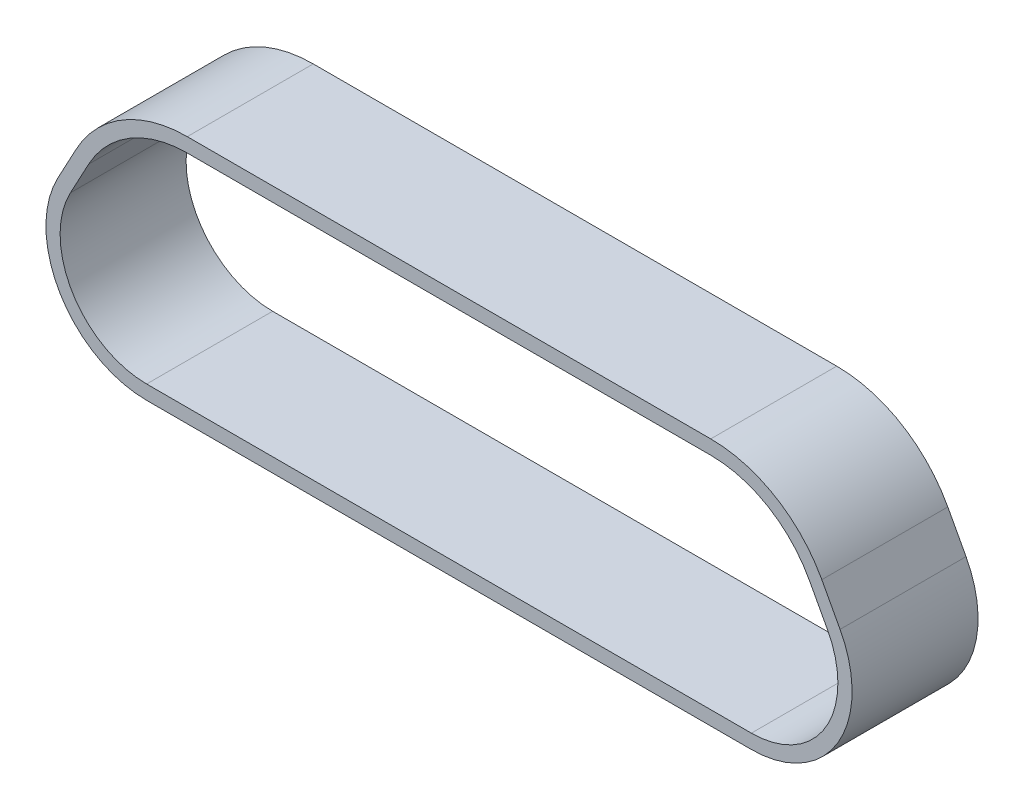
ISO-10303-21;
HEADER;
FILE_DESCRIPTION(('STEP AP214'),'2;1');
FILE_NAME('part.step','',(''),(''),'','','');
FILE_SCHEMA(('AUTOMOTIVE_DESIGN { 1 0 10303 214 1 1 1 1 }'));
ENDSEC;
DATA;
#1=APPLICATION_CONTEXT('core data for automotive mechanical design processes');
#2=APPLICATION_PROTOCOL_DEFINITION('international standard','automotive_design',2000,#1);
#3=PRODUCT_CONTEXT('',#1,'mechanical');
#4=PRODUCT('Part','Part','',(#3));
#5=PRODUCT_RELATED_PRODUCT_CATEGORY('part','',(#4));
#6=PRODUCT_DEFINITION_FORMATION('','',#4);
#7=PRODUCT_DEFINITION_CONTEXT('part definition',#1,'design');
#8=PRODUCT_DEFINITION('design','',#6,#7);
#9=PRODUCT_DEFINITION_SHAPE('','',#8);
#10=(LENGTH_UNIT() NAMED_UNIT(*) SI_UNIT(.MILLI.,.METRE.));
#11=(NAMED_UNIT(*) PLANE_ANGLE_UNIT() SI_UNIT($,.RADIAN.));
#12=(NAMED_UNIT(*) SI_UNIT($,.STERADIAN.) SOLID_ANGLE_UNIT());
#13=UNCERTAINTY_MEASURE_WITH_UNIT(LENGTH_MEASURE(1.E-05),#10,'distance_accuracy_value','');
#14=(GEOMETRIC_REPRESENTATION_CONTEXT(3) GLOBAL_UNCERTAINTY_ASSIGNED_CONTEXT((#13)) GLOBAL_UNIT_ASSIGNED_CONTEXT((#10,
#11,#12)) REPRESENTATION_CONTEXT('',''));
#15=CARTESIAN_POINT('',(0.,0.,0.));
#16=DIRECTION('',(0.,0.,1.));
#17=DIRECTION('',(1.,0.,0.));
#18=AXIS2_PLACEMENT_3D('',#15,#16,#17);
#19=CARTESIAN_POINT('',(96.,0.,40.));
#20=DIRECTION('',(0.,0.,1.));
#21=DIRECTION('',(1.,0.,0.));
#22=AXIS2_PLACEMENT_3D('',#19,#20,#21);
#23=PLANE('',#22);
#24=CARTESIAN_POINT('',(96.,0.,40.));
#25=DIRECTION('',(0.,0.,1.));
#26=DIRECTION('',(1.,0.,0.));
#27=AXIS2_PLACEMENT_3D('',#24,#25,#26);
#28=CIRCLE('',#27,31.97);
#29=CARTESIAN_POINT('',(96.,-31.97,40.));
#30=VERTEX_POINT('',#29);
#31=CARTESIAN_POINT('',(124.157226452266,15.1410534149975,40.));
#32=VERTEX_POINT('',#31);
#33=EDGE_CURVE('E261',#30,#32,#28,.T.);
#34=ORIENTED_EDGE('',*,*,#33,.T.);
#35=DIRECTION('',(-0.473601921019627,0.880739019464063,0.));
#36=VECTOR('',#35,1.);
#37=CARTESIAN_POINT('',(118.364790339341,25.9130209176259,40.));
#38=LINE('',#37,#36);
#39=CARTESIAN_POINT('',(118.364790339341,25.9130209176259,40.));
#40=VERTEX_POINT('',#39);
#41=EDGE_CURVE('E264',#32,#40,#38,.T.);
#42=ORIENTED_EDGE('',*,*,#41,.T.);
#43=CARTESIAN_POINT('',(83.1,6.95,40.));
#44=DIRECTION('',(0.,0.,1.));
#45=DIRECTION('',(1.,0.,0.));
#46=AXIS2_PLACEMENT_3D('',#43,#44,#45);
#47=CIRCLE('',#46,40.04);
#48=CARTESIAN_POINT('',(83.1,46.99,40.));
#49=VERTEX_POINT('',#48);
#50=EDGE_CURVE('E267',#40,#49,#47,.T.);
#51=ORIENTED_EDGE('',*,*,#50,.T.);
#52=DIRECTION('',(-1.,0.,0.));
#53=VECTOR('',#52,1.);
#54=CARTESIAN_POINT('',(-83.1,46.99,40.));
#55=LINE('',#54,#53);
#56=CARTESIAN_POINT('',(-83.1,46.99,40.));
#57=VERTEX_POINT('',#56);
#58=EDGE_CURVE('E269',#49,#57,#55,.T.);
#59=ORIENTED_EDGE('',*,*,#58,.T.);
#60=CARTESIAN_POINT('',(-83.1,6.95,40.));
#61=DIRECTION('',(0.,0.,1.));
#62=DIRECTION('',(1.,0.,0.));
#63=AXIS2_PLACEMENT_3D('',#60,#61,#62);
#64=CIRCLE('',#63,40.04);
#65=CARTESIAN_POINT('',(-118.364790339341,25.9130209176259,40.));
#66=VERTEX_POINT('',#65);
#67=EDGE_CURVE('E271',#57,#66,#64,.T.);
#68=ORIENTED_EDGE('',*,*,#67,.T.);
#69=DIRECTION('',(-0.473601921019628,-0.880739019464062,0.));
#70=VECTOR('',#69,1.);
#71=CARTESIAN_POINT('',(-124.157226452266,15.1410534149975,40.));
#72=LINE('',#71,#70);
#73=CARTESIAN_POINT('',(-124.157226452266,15.1410534149975,40.));
#74=VERTEX_POINT('',#73);
#75=EDGE_CURVE('E273',#66,#74,#72,.T.);
#76=ORIENTED_EDGE('',*,*,#75,.T.);
#77=CARTESIAN_POINT('',(-96.,0.,40.));
#78=DIRECTION('',(0.,0.,1.));
#79=DIRECTION('',(1.,0.,0.));
#80=AXIS2_PLACEMENT_3D('',#77,#78,#79);
#81=CIRCLE('',#80,31.97);
#82=CARTESIAN_POINT('',(-96.,-31.97,40.));
#83=VERTEX_POINT('',#82);
#84=EDGE_CURVE('E275',#74,#83,#81,.T.);
#85=ORIENTED_EDGE('',*,*,#84,.T.);
#86=DIRECTION('',(1.,0.,0.));
#87=VECTOR('',#86,1.);
#88=CARTESIAN_POINT('',(-96.,-31.97,40.));
#89=LINE('',#88,#87);
#90=EDGE_CURVE('E277',#83,#30,#89,.T.);
#91=ORIENTED_EDGE('',*,*,#90,.T.);
#92=EDGE_LOOP('',(#34,#42,#51,#59,#68,#76,#85,#91));
#93=FACE_BOUND('',#92,.T.);
#94=DIRECTION('',(-0.473601921019627,0.880739019464063,0.));
#95=VECTOR('',#94,1.);
#96=CARTESIAN_POINT('',(114.401464751753,23.7818122730376,40.));
#97=LINE('',#96,#95);
#98=CARTESIAN_POINT('',(120.193900864678,13.0098447704092,40.));
#99=VERTEX_POINT('',#98);
#100=CARTESIAN_POINT('',(114.401464751753,23.7818122730376,40.));
#101=VERTEX_POINT('',#100);
#102=EDGE_CURVE('E204',#99,#101,#97,.T.);
#103=ORIENTED_EDGE('',*,*,#102,.F.);
#104=CARTESIAN_POINT('',(96.,0.,40.));
#105=DIRECTION('',(0.,0.,1.));
#106=DIRECTION('',(1.,0.,0.));
#107=AXIS2_PLACEMENT_3D('',#104,#105,#106);
#108=CIRCLE('',#107,27.47);
#109=CARTESIAN_POINT('',(96.,-27.47,40.));
#110=VERTEX_POINT('',#109);
#111=EDGE_CURVE('E196',#110,#99,#108,.T.);
#112=ORIENTED_EDGE('',*,*,#111,.F.);
#113=DIRECTION('',(1.,0.,0.));
#114=VECTOR('',#113,1.);
#115=CARTESIAN_POINT('',(-96.,-27.47,40.));
#116=LINE('',#115,#114);
#117=CARTESIAN_POINT('',(-96.,-27.47,40.));
#118=VERTEX_POINT('',#117);
#119=EDGE_CURVE('E229',#118,#110,#116,.T.);
#120=ORIENTED_EDGE('',*,*,#119,.F.);
#121=CARTESIAN_POINT('',(-96.,0.,40.));
#122=DIRECTION('',(0.,0.,1.));
#123=DIRECTION('',(1.,0.,0.));
#124=AXIS2_PLACEMENT_3D('',#121,#122,#123);
#125=CIRCLE('',#124,27.47);
#126=CARTESIAN_POINT('',(-120.193900864678,13.0098447704092,40.));
#127=VERTEX_POINT('',#126);
#128=EDGE_CURVE('E227',#127,#118,#125,.T.);
#129=ORIENTED_EDGE('',*,*,#128,.F.);
#130=DIRECTION('',(-0.473601921019628,-0.880739019464062,0.));
#131=VECTOR('',#130,1.);
#132=CARTESIAN_POINT('',(-120.193900864678,13.0098447704092,40.));
#133=LINE('',#132,#131);
#134=CARTESIAN_POINT('',(-114.401464751753,23.7818122730376,40.));
#135=VERTEX_POINT('',#134);
#136=EDGE_CURVE('E225',#135,#127,#133,.T.);
#137=ORIENTED_EDGE('',*,*,#136,.F.);
#138=CARTESIAN_POINT('',(-83.1,6.95,40.));
#139=DIRECTION('',(0.,0.,1.));
#140=DIRECTION('',(1.,0.,0.));
#141=AXIS2_PLACEMENT_3D('',#138,#139,#140);
#142=CIRCLE('',#141,35.54);
#143=CARTESIAN_POINT('',(-83.1,42.49,40.));
#144=VERTEX_POINT('',#143);
#145=EDGE_CURVE('E223',#144,#135,#142,.T.);
#146=ORIENTED_EDGE('',*,*,#145,.F.);
#147=DIRECTION('',(-1.,0.,0.));
#148=VECTOR('',#147,1.);
#149=CARTESIAN_POINT('',(-83.1,42.49,40.));
#150=LINE('',#149,#148);
#151=CARTESIAN_POINT('',(83.1,42.49,40.));
#152=VERTEX_POINT('',#151);
#153=EDGE_CURVE('E219',#152,#144,#150,.T.);
#154=ORIENTED_EDGE('',*,*,#153,.F.);
#155=CARTESIAN_POINT('',(83.1,6.95,40.));
#156=DIRECTION('',(0.,0.,1.));
#157=DIRECTION('',(1.,0.,0.));
#158=AXIS2_PLACEMENT_3D('',#155,#156,#157);
#159=CIRCLE('',#158,35.54);
#160=EDGE_CURVE('E217',#101,#152,#159,.T.);
#161=ORIENTED_EDGE('',*,*,#160,.F.);
#162=EDGE_LOOP('',(#103,#112,#120,#129,#137,#146,#154,#161));
#163=FACE_BOUND('',#162,.T.);
#164=ADVANCED_FACE('F83',(#93,#163),#23,.T.);
#165=CARTESIAN_POINT('',(96.,0.,0.));
#166=DIRECTION('',(0.,0.,1.));
#167=DIRECTION('',(1.,0.,0.));
#168=AXIS2_PLACEMENT_3D('',#165,#166,#167);
#169=PLANE('',#168);
#170=CARTESIAN_POINT('',(96.,0.,0.));
#171=DIRECTION('',(0.,0.,1.));
#172=DIRECTION('',(1.,0.,0.));
#173=AXIS2_PLACEMENT_3D('',#170,#171,#172);
#174=CIRCLE('',#173,31.97);
#175=CARTESIAN_POINT('',(96.,-31.97,0.));
#176=VERTEX_POINT('',#175);
#177=CARTESIAN_POINT('',(124.157226452266,15.1410534149975,0.));
#178=VERTEX_POINT('',#177);
#179=EDGE_CURVE('E212',#176,#178,#174,.T.);
#180=ORIENTED_EDGE('',*,*,#179,.F.);
#181=DIRECTION('',(1.,0.,0.));
#182=VECTOR('',#181,1.);
#183=CARTESIAN_POINT('',(-96.,-31.97,0.));
#184=LINE('',#183,#182);
#185=CARTESIAN_POINT('',(-96.,-31.97,0.));
#186=VERTEX_POINT('',#185);
#187=EDGE_CURVE('E265',#186,#176,#184,.T.);
#188=ORIENTED_EDGE('',*,*,#187,.F.);
#189=CARTESIAN_POINT('',(-96.,0.,0.));
#190=DIRECTION('',(0.,0.,1.));
#191=DIRECTION('',(1.,0.,0.));
#192=AXIS2_PLACEMENT_3D('',#189,#190,#191);
#193=CIRCLE('',#192,31.97);
#194=CARTESIAN_POINT('',(-124.157226452266,15.1410534149975,0.));
#195=VERTEX_POINT('',#194);
#196=EDGE_CURVE('E292',#195,#186,#193,.T.);
#197=ORIENTED_EDGE('',*,*,#196,.F.);
#198=DIRECTION('',(-0.473601921019628,-0.880739019464062,0.));
#199=VECTOR('',#198,1.);
#200=CARTESIAN_POINT('',(-124.157226452266,15.1410534149975,0.));
#201=LINE('',#200,#199);
#202=CARTESIAN_POINT('',(-118.364790339341,25.9130209176259,0.));
#203=VERTEX_POINT('',#202);
#204=EDGE_CURVE('E290',#203,#195,#201,.T.);
#205=ORIENTED_EDGE('',*,*,#204,.F.);
#206=CARTESIAN_POINT('',(-83.1,6.95,0.));
#207=DIRECTION('',(0.,0.,1.));
#208=DIRECTION('',(1.,0.,0.));
#209=AXIS2_PLACEMENT_3D('',#206,#207,#208);
#210=CIRCLE('',#209,40.04);
#211=CARTESIAN_POINT('',(-83.1,46.99,0.));
#212=VERTEX_POINT('',#211);
#213=EDGE_CURVE('E288',#212,#203,#210,.T.);
#214=ORIENTED_EDGE('',*,*,#213,.F.);
#215=DIRECTION('',(-1.,0.,0.));
#216=VECTOR('',#215,1.);
#217=CARTESIAN_POINT('',(-83.1,46.99,0.));
#218=LINE('',#217,#216);
#219=CARTESIAN_POINT('',(83.1,46.99,0.));
#220=VERTEX_POINT('',#219);
#221=EDGE_CURVE('E286',#220,#212,#218,.T.);
#222=ORIENTED_EDGE('',*,*,#221,.F.);
#223=CARTESIAN_POINT('',(83.1,6.95,0.));
#224=DIRECTION('',(0.,0.,1.));
#225=DIRECTION('',(1.,0.,0.));
#226=AXIS2_PLACEMENT_3D('',#223,#224,#225);
#227=CIRCLE('',#226,40.04);
#228=CARTESIAN_POINT('',(118.364790339341,25.9130209176259,0.));
#229=VERTEX_POINT('',#228);
#230=EDGE_CURVE('E284',#229,#220,#227,.T.);
#231=ORIENTED_EDGE('',*,*,#230,.F.);
#232=DIRECTION('',(-0.473601921019627,0.880739019464063,0.));
#233=VECTOR('',#232,1.);
#234=CARTESIAN_POINT('',(118.364790339341,25.9130209176259,0.));
#235=LINE('',#234,#233);
#236=EDGE_CURVE('E282',#178,#229,#235,.T.);
#237=ORIENTED_EDGE('',*,*,#236,.F.);
#238=EDGE_LOOP('',(#180,#188,#197,#205,#214,#222,#231,#237));
#239=FACE_BOUND('',#238,.T.);
#240=CARTESIAN_POINT('',(96.,0.,0.));
#241=DIRECTION('',(0.,0.,1.));
#242=DIRECTION('',(1.,0.,0.));
#243=AXIS2_PLACEMENT_3D('',#240,#241,#242);
#244=CIRCLE('',#243,27.47);
#245=CARTESIAN_POINT('',(96.,-27.47,0.));
#246=VERTEX_POINT('',#245);
#247=CARTESIAN_POINT('',(120.193900864678,13.0098447704092,0.));
#248=VERTEX_POINT('',#247);
#249=EDGE_CURVE('E106',#246,#248,#244,.T.);
#250=ORIENTED_EDGE('',*,*,#249,.T.);
#251=DIRECTION('',(-0.473601921019627,0.880739019464063,0.));
#252=VECTOR('',#251,1.);
#253=CARTESIAN_POINT('',(114.401464751753,23.7818122730376,0.));
#254=LINE('',#253,#252);
#255=CARTESIAN_POINT('',(114.401464751753,23.7818122730376,0.));
#256=VERTEX_POINT('',#255);
#257=EDGE_CURVE('E211',#248,#256,#254,.T.);
#258=ORIENTED_EDGE('',*,*,#257,.T.);
#259=CARTESIAN_POINT('',(83.1,6.95,0.));
#260=DIRECTION('',(0.,0.,1.));
#261=DIRECTION('',(1.,0.,0.));
#262=AXIS2_PLACEMENT_3D('',#259,#260,#261);
#263=CIRCLE('',#262,35.54);
#264=CARTESIAN_POINT('',(83.1,42.49,0.));
#265=VERTEX_POINT('',#264);
#266=EDGE_CURVE('E233',#256,#265,#263,.T.);
#267=ORIENTED_EDGE('',*,*,#266,.T.);
#268=DIRECTION('',(-1.,0.,0.));
#269=VECTOR('',#268,1.);
#270=CARTESIAN_POINT('',(-83.1,42.49,0.));
#271=LINE('',#270,#269);
#272=CARTESIAN_POINT('',(-83.1,42.49,0.));
#273=VERTEX_POINT('',#272);
#274=EDGE_CURVE('E236',#265,#273,#271,.T.);
#275=ORIENTED_EDGE('',*,*,#274,.T.);
#276=CARTESIAN_POINT('',(-83.1,6.95,0.));
#277=DIRECTION('',(0.,0.,1.));
#278=DIRECTION('',(1.,0.,0.));
#279=AXIS2_PLACEMENT_3D('',#276,#277,#278);
#280=CIRCLE('',#279,35.54);
#281=CARTESIAN_POINT('',(-114.401464751753,23.7818122730376,0.));
#282=VERTEX_POINT('',#281);
#283=EDGE_CURVE('E239',#273,#282,#280,.T.);
#284=ORIENTED_EDGE('',*,*,#283,.T.);
#285=DIRECTION('',(-0.473601921019628,-0.880739019464062,0.));
#286=VECTOR('',#285,1.);
#287=CARTESIAN_POINT('',(-120.193900864678,13.0098447704092,0.));
#288=LINE('',#287,#286);
#289=CARTESIAN_POINT('',(-120.193900864678,13.0098447704092,0.));
#290=VERTEX_POINT('',#289);
#291=EDGE_CURVE('E242',#282,#290,#288,.T.);
#292=ORIENTED_EDGE('',*,*,#291,.T.);
#293=CARTESIAN_POINT('',(-96.,0.,0.));
#294=DIRECTION('',(0.,0.,1.));
#295=DIRECTION('',(1.,0.,0.));
#296=AXIS2_PLACEMENT_3D('',#293,#294,#295);
#297=CIRCLE('',#296,27.47);
#298=CARTESIAN_POINT('',(-96.,-27.47,0.));
#299=VERTEX_POINT('',#298);
#300=EDGE_CURVE('E245',#290,#299,#297,.T.);
#301=ORIENTED_EDGE('',*,*,#300,.T.);
#302=DIRECTION('',(1.,0.,0.));
#303=VECTOR('',#302,1.);
#304=CARTESIAN_POINT('',(-96.,-27.47,0.));
#305=LINE('',#304,#303);
#306=EDGE_CURVE('E205',#299,#246,#305,.T.);
#307=ORIENTED_EDGE('',*,*,#306,.T.);
#308=EDGE_LOOP('',(#250,#258,#267,#275,#284,#292,#301,#307));
#309=FACE_BOUND('',#308,.T.);
#310=ADVANCED_FACE('F322',(#239,#309),#169,.F.);
#311=CARTESIAN_POINT('',(96.,0.,40.));
#312=DIRECTION('',(0.,0.,-1.));
#313=DIRECTION('',(-1.,0.,0.));
#314=AXIS2_PLACEMENT_3D('',#311,#312,#313);
#315=CYLINDRICAL_SURFACE('',#314,31.97);
#316=ORIENTED_EDGE('',*,*,#179,.T.);
#317=DIRECTION('',(0.,0.,-1.));
#318=VECTOR('',#317,1.);
#319=CARTESIAN_POINT('',(124.157226452266,15.1410534149975,40.));
#320=LINE('',#319,#318);
#321=EDGE_CURVE('E12',#32,#178,#320,.T.);
#322=ORIENTED_EDGE('',*,*,#321,.F.);
#323=ORIENTED_EDGE('',*,*,#33,.F.);
#324=DIRECTION('',(0.,0.,-1.));
#325=VECTOR('',#324,1.);
#326=CARTESIAN_POINT('',(96.,-31.97,40.));
#327=LINE('',#326,#325);
#328=EDGE_CURVE('E279',#30,#176,#327,.T.);
#329=ORIENTED_EDGE('',*,*,#328,.T.);
#330=EDGE_LOOP('',(#316,#322,#323,#329));
#331=FACE_BOUND('',#330,.T.);
#332=ADVANCED_FACE('F85',(#331),#315,.T.);
#333=CARTESIAN_POINT('',(118.364790339341,25.9130209176259,40.));
#334=DIRECTION('',(-0.880739019464063,-0.473601921019627,0.));
#335=DIRECTION('',(0.473601921019627,-0.880739019464063,0.));
#336=AXIS2_PLACEMENT_3D('',#333,#334,#335);
#337=PLANE('',#336);
#338=ORIENTED_EDGE('',*,*,#236,.T.);
#339=DIRECTION('',(0.,0.,-1.));
#340=VECTOR('',#339,1.);
#341=CARTESIAN_POINT('',(118.364790339341,25.9130209176259,40.));
#342=LINE('',#341,#340);
#343=EDGE_CURVE('E91',#40,#229,#342,.T.);
#344=ORIENTED_EDGE('',*,*,#343,.F.);
#345=ORIENTED_EDGE('',*,*,#41,.F.);
#346=ORIENTED_EDGE('',*,*,#321,.T.);
#347=EDGE_LOOP('',(#338,#344,#345,#346));
#348=FACE_BOUND('',#347,.T.);
#349=ADVANCED_FACE('F339',(#348),#337,.F.);
#350=CARTESIAN_POINT('',(83.1,6.95,40.));
#351=DIRECTION('',(0.,0.,-1.));
#352=DIRECTION('',(-1.,0.,0.));
#353=AXIS2_PLACEMENT_3D('',#350,#351,#352);
#354=CYLINDRICAL_SURFACE('',#353,40.04);
#355=ORIENTED_EDGE('',*,*,#230,.T.);
#356=DIRECTION('',(0.,0.,-1.));
#357=VECTOR('',#356,1.);
#358=CARTESIAN_POINT('',(83.1,46.99,40.));
#359=LINE('',#358,#357);
#360=EDGE_CURVE('E309',#49,#220,#359,.T.);
#361=ORIENTED_EDGE('',*,*,#360,.F.);
#362=ORIENTED_EDGE('',*,*,#50,.F.);
#363=ORIENTED_EDGE('',*,*,#343,.T.);
#364=EDGE_LOOP('',(#355,#361,#362,#363));
#365=FACE_BOUND('',#364,.T.);
#366=ADVANCED_FACE('F316',(#365),#354,.T.);
#367=CARTESIAN_POINT('',(-83.1,46.99,40.));
#368=DIRECTION('',(0.,-1.,0.));
#369=DIRECTION('',(0.,0.,-1.));
#370=AXIS2_PLACEMENT_3D('',#367,#368,#369);
#371=PLANE('',#370);
#372=ORIENTED_EDGE('',*,*,#221,.T.);
#373=DIRECTION('',(0.,0.,-1.));
#374=VECTOR('',#373,1.);
#375=CARTESIAN_POINT('',(-83.1,46.99,40.));
#376=LINE('',#375,#374);
#377=EDGE_CURVE('E306',#57,#212,#376,.T.);
#378=ORIENTED_EDGE('',*,*,#377,.F.);
#379=ORIENTED_EDGE('',*,*,#58,.F.);
#380=ORIENTED_EDGE('',*,*,#360,.T.);
#381=EDGE_LOOP('',(#372,#378,#379,#380));
#382=FACE_BOUND('',#381,.T.);
#383=ADVANCED_FACE('F328',(#382),#371,.F.);
#384=CARTESIAN_POINT('',(-83.1,6.95,40.));
#385=DIRECTION('',(0.,0.,-1.));
#386=DIRECTION('',(-1.,0.,0.));
#387=AXIS2_PLACEMENT_3D('',#384,#385,#386);
#388=CYLINDRICAL_SURFACE('',#387,40.04);
#389=ORIENTED_EDGE('',*,*,#213,.T.);
#390=DIRECTION('',(0.,0.,-1.));
#391=VECTOR('',#390,1.);
#392=CARTESIAN_POINT('',(-118.364790339341,25.9130209176259,40.));
#393=LINE('',#392,#391);
#394=EDGE_CURVE('E303',#66,#203,#393,.T.);
#395=ORIENTED_EDGE('',*,*,#394,.F.);
#396=ORIENTED_EDGE('',*,*,#67,.F.);
#397=ORIENTED_EDGE('',*,*,#377,.T.);
#398=EDGE_LOOP('',(#389,#395,#396,#397));
#399=FACE_BOUND('',#398,.T.);
#400=ADVANCED_FACE('F332',(#399),#388,.T.);
#401=CARTESIAN_POINT('',(-124.157226452266,15.1410534149975,40.));
#402=DIRECTION('',(0.880739019464062,-0.473601921019628,0.));
#403=DIRECTION('',(0.473601921019628,0.880739019464062,0.));
#404=AXIS2_PLACEMENT_3D('',#401,#402,#403);
#405=PLANE('',#404);
#406=ORIENTED_EDGE('',*,*,#204,.T.);
#407=DIRECTION('',(0.,0.,-1.));
#408=VECTOR('',#407,1.);
#409=CARTESIAN_POINT('',(-124.157226452266,15.1410534149975,40.));
#410=LINE('',#409,#408);
#411=EDGE_CURVE('E300',#74,#195,#410,.T.);
#412=ORIENTED_EDGE('',*,*,#411,.F.);
#413=ORIENTED_EDGE('',*,*,#75,.F.);
#414=ORIENTED_EDGE('',*,*,#394,.T.);
#415=EDGE_LOOP('',(#406,#412,#413,#414));
#416=FACE_BOUND('',#415,.T.);
#417=ADVANCED_FACE('F352',(#416),#405,.F.);
#418=CARTESIAN_POINT('',(-96.,0.,40.));
#419=DIRECTION('',(0.,0.,-1.));
#420=DIRECTION('',(-1.,0.,0.));
#421=AXIS2_PLACEMENT_3D('',#418,#419,#420);
#422=CYLINDRICAL_SURFACE('',#421,31.97);
#423=ORIENTED_EDGE('',*,*,#196,.T.);
#424=DIRECTION('',(0.,0.,-1.));
#425=VECTOR('',#424,1.);
#426=CARTESIAN_POINT('',(-96.,-31.97,40.));
#427=LINE('',#426,#425);
#428=EDGE_CURVE('E297',#83,#186,#427,.T.);
#429=ORIENTED_EDGE('',*,*,#428,.F.);
#430=ORIENTED_EDGE('',*,*,#84,.F.);
#431=ORIENTED_EDGE('',*,*,#411,.T.);
#432=EDGE_LOOP('',(#423,#429,#430,#431));
#433=FACE_BOUND('',#432,.T.);
#434=ADVANCED_FACE('F350',(#433),#422,.T.);
#435=CARTESIAN_POINT('',(-96.,-31.97,40.));
#436=DIRECTION('',(0.,1.,0.));
#437=DIRECTION('',(0.,0.,1.));
#438=AXIS2_PLACEMENT_3D('',#435,#436,#437);
#439=PLANE('',#438);
#440=ORIENTED_EDGE('',*,*,#187,.T.);
#441=ORIENTED_EDGE('',*,*,#328,.F.);
#442=ORIENTED_EDGE('',*,*,#90,.F.);
#443=ORIENTED_EDGE('',*,*,#428,.T.);
#444=EDGE_LOOP('',(#440,#441,#442,#443));
#445=FACE_BOUND('',#444,.T.);
#446=ADVANCED_FACE('F345',(#445),#439,.F.);
#447=CARTESIAN_POINT('',(96.,0.,40.));
#448=DIRECTION('',(0.,0.,-1.));
#449=DIRECTION('',(-1.,0.,0.));
#450=AXIS2_PLACEMENT_3D('',#447,#448,#449);
#451=CYLINDRICAL_SURFACE('',#450,27.47);
#452=ORIENTED_EDGE('',*,*,#249,.F.);
#453=DIRECTION('',(0.,0.,-1.));
#454=VECTOR('',#453,1.);
#455=CARTESIAN_POINT('',(96.,-27.47,40.));
#456=LINE('',#455,#454);
#457=EDGE_CURVE('E200',#110,#246,#456,.T.);
#458=ORIENTED_EDGE('',*,*,#457,.F.);
#459=ORIENTED_EDGE('',*,*,#111,.T.);
#460=DIRECTION('',(0.,0.,-1.));
#461=VECTOR('',#460,1.);
#462=CARTESIAN_POINT('',(120.193900864678,13.0098447704092,40.));
#463=LINE('',#462,#461);
#464=EDGE_CURVE('E199',#99,#248,#463,.T.);
#465=ORIENTED_EDGE('',*,*,#464,.T.);
#466=EDGE_LOOP('',(#452,#458,#459,#465));
#467=FACE_BOUND('',#466,.T.);
#468=ADVANCED_FACE('F198',(#467),#451,.F.);
#469=CARTESIAN_POINT('',(114.401464751753,23.7818122730376,40.));
#470=DIRECTION('',(-0.880739019464063,-0.473601921019627,0.));
#471=DIRECTION('',(0.473601921019627,-0.880739019464063,0.));
#472=AXIS2_PLACEMENT_3D('',#469,#470,#471);
#473=PLANE('',#472);
#474=ORIENTED_EDGE('',*,*,#257,.F.);
#475=ORIENTED_EDGE('',*,*,#464,.F.);
#476=ORIENTED_EDGE('',*,*,#102,.T.);
#477=DIRECTION('',(0.,0.,-1.));
#478=VECTOR('',#477,1.);
#479=CARTESIAN_POINT('',(114.401464751753,23.7818122730376,40.));
#480=LINE('',#479,#478);
#481=EDGE_CURVE('E213',#101,#256,#480,.T.);
#482=ORIENTED_EDGE('',*,*,#481,.T.);
#483=EDGE_LOOP('',(#474,#475,#476,#482));
#484=FACE_BOUND('',#483,.T.);
#485=ADVANCED_FACE('F208',(#484),#473,.T.);
#486=CARTESIAN_POINT('',(83.1,6.95,40.));
#487=DIRECTION('',(0.,0.,-1.));
#488=DIRECTION('',(-1.,0.,0.));
#489=AXIS2_PLACEMENT_3D('',#486,#487,#488);
#490=CYLINDRICAL_SURFACE('',#489,35.54);
#491=ORIENTED_EDGE('',*,*,#266,.F.);
#492=ORIENTED_EDGE('',*,*,#481,.F.);
#493=ORIENTED_EDGE('',*,*,#160,.T.);
#494=DIRECTION('',(0.,0.,-1.));
#495=VECTOR('',#494,1.);
#496=CARTESIAN_POINT('',(83.1,42.49,40.));
#497=LINE('',#496,#495);
#498=EDGE_CURVE('E258',#152,#265,#497,.T.);
#499=ORIENTED_EDGE('',*,*,#498,.T.);
#500=EDGE_LOOP('',(#491,#492,#493,#499));
#501=FACE_BOUND('',#500,.T.);
#502=ADVANCED_FACE('F377',(#501),#490,.F.);
#503=CARTESIAN_POINT('',(-83.1,42.49,40.));
#504=DIRECTION('',(0.,-1.,0.));
#505=DIRECTION('',(0.,0.,-1.));
#506=AXIS2_PLACEMENT_3D('',#503,#504,#505);
#507=PLANE('',#506);
#508=ORIENTED_EDGE('',*,*,#274,.F.);
#509=ORIENTED_EDGE('',*,*,#498,.F.);
#510=ORIENTED_EDGE('',*,*,#153,.T.);
#511=DIRECTION('',(0.,0.,-1.));
#512=VECTOR('',#511,1.);
#513=CARTESIAN_POINT('',(-83.1,42.49,40.));
#514=LINE('',#513,#512);
#515=EDGE_CURVE('E256',#144,#273,#514,.T.);
#516=ORIENTED_EDGE('',*,*,#515,.T.);
#517=EDGE_LOOP('',(#508,#509,#510,#516));
#518=FACE_BOUND('',#517,.T.);
#519=ADVANCED_FACE('F381',(#518),#507,.T.);
#520=CARTESIAN_POINT('',(-83.1,6.95,40.));
#521=DIRECTION('',(0.,0.,-1.));
#522=DIRECTION('',(-1.,0.,0.));
#523=AXIS2_PLACEMENT_3D('',#520,#521,#522);
#524=CYLINDRICAL_SURFACE('',#523,35.54);
#525=ORIENTED_EDGE('',*,*,#283,.F.);
#526=ORIENTED_EDGE('',*,*,#515,.F.);
#527=ORIENTED_EDGE('',*,*,#145,.T.);
#528=DIRECTION('',(0.,0.,-1.));
#529=VECTOR('',#528,1.);
#530=CARTESIAN_POINT('',(-114.401464751753,23.7818122730376,40.));
#531=LINE('',#530,#529);
#532=EDGE_CURVE('E254',#135,#282,#531,.T.);
#533=ORIENTED_EDGE('',*,*,#532,.T.);
#534=EDGE_LOOP('',(#525,#526,#527,#533));
#535=FACE_BOUND('',#534,.T.);
#536=ADVANCED_FACE('F387',(#535),#524,.F.);
#537=CARTESIAN_POINT('',(-120.193900864678,13.0098447704092,40.));
#538=DIRECTION('',(0.880739019464062,-0.473601921019628,0.));
#539=DIRECTION('',(0.473601921019628,0.880739019464062,0.));
#540=AXIS2_PLACEMENT_3D('',#537,#538,#539);
#541=PLANE('',#540);
#542=ORIENTED_EDGE('',*,*,#291,.F.);
#543=ORIENTED_EDGE('',*,*,#532,.F.);
#544=ORIENTED_EDGE('',*,*,#136,.T.);
#545=DIRECTION('',(0.,0.,-1.));
#546=VECTOR('',#545,1.);
#547=CARTESIAN_POINT('',(-120.193900864678,13.0098447704092,40.));
#548=LINE('',#547,#546);
#549=EDGE_CURVE('E252',#127,#290,#548,.T.);
#550=ORIENTED_EDGE('',*,*,#549,.T.);
#551=EDGE_LOOP('',(#542,#543,#544,#550));
#552=FACE_BOUND('',#551,.T.);
#553=ADVANCED_FACE('F391',(#552),#541,.T.);
#554=CARTESIAN_POINT('',(-96.,0.,40.));
#555=DIRECTION('',(0.,0.,-1.));
#556=DIRECTION('',(-1.,0.,0.));
#557=AXIS2_PLACEMENT_3D('',#554,#555,#556);
#558=CYLINDRICAL_SURFACE('',#557,27.47);
#559=ORIENTED_EDGE('',*,*,#300,.F.);
#560=ORIENTED_EDGE('',*,*,#549,.F.);
#561=ORIENTED_EDGE('',*,*,#128,.T.);
#562=DIRECTION('',(0.,0.,-1.));
#563=VECTOR('',#562,1.);
#564=CARTESIAN_POINT('',(-96.,-27.47,40.));
#565=LINE('',#564,#563);
#566=EDGE_CURVE('E98',#118,#299,#565,.T.);
#567=ORIENTED_EDGE('',*,*,#566,.T.);
#568=EDGE_LOOP('',(#559,#560,#561,#567));
#569=FACE_BOUND('',#568,.T.);
#570=ADVANCED_FACE('F395',(#569),#558,.F.);
#571=CARTESIAN_POINT('',(-96.,-27.47,40.));
#572=DIRECTION('',(0.,1.,0.));
#573=DIRECTION('',(0.,0.,1.));
#574=AXIS2_PLACEMENT_3D('',#571,#572,#573);
#575=PLANE('',#574);
#576=ORIENTED_EDGE('',*,*,#306,.F.);
#577=ORIENTED_EDGE('',*,*,#566,.F.);
#578=ORIENTED_EDGE('',*,*,#119,.T.);
#579=ORIENTED_EDGE('',*,*,#457,.T.);
#580=EDGE_LOOP('',(#576,#577,#578,#579));
#581=FACE_BOUND('',#580,.T.);
#582=ADVANCED_FACE('F399',(#581),#575,.T.);
#583=CLOSED_SHELL('',(#164,#310,#332,#349,#366,#383,#400,#417,#434,#446,#468,#485,#502,#519,
#536,#553,#570,#582));
#584=MANIFOLD_SOLID_BREP('B2',#583);
#585=ADVANCED_BREP_SHAPE_REPRESENTATION('',(#18,#584),#14);
#586=SHAPE_DEFINITION_REPRESENTATION(#9,#585);
ENDSEC;
END-ISO-10303-21;
